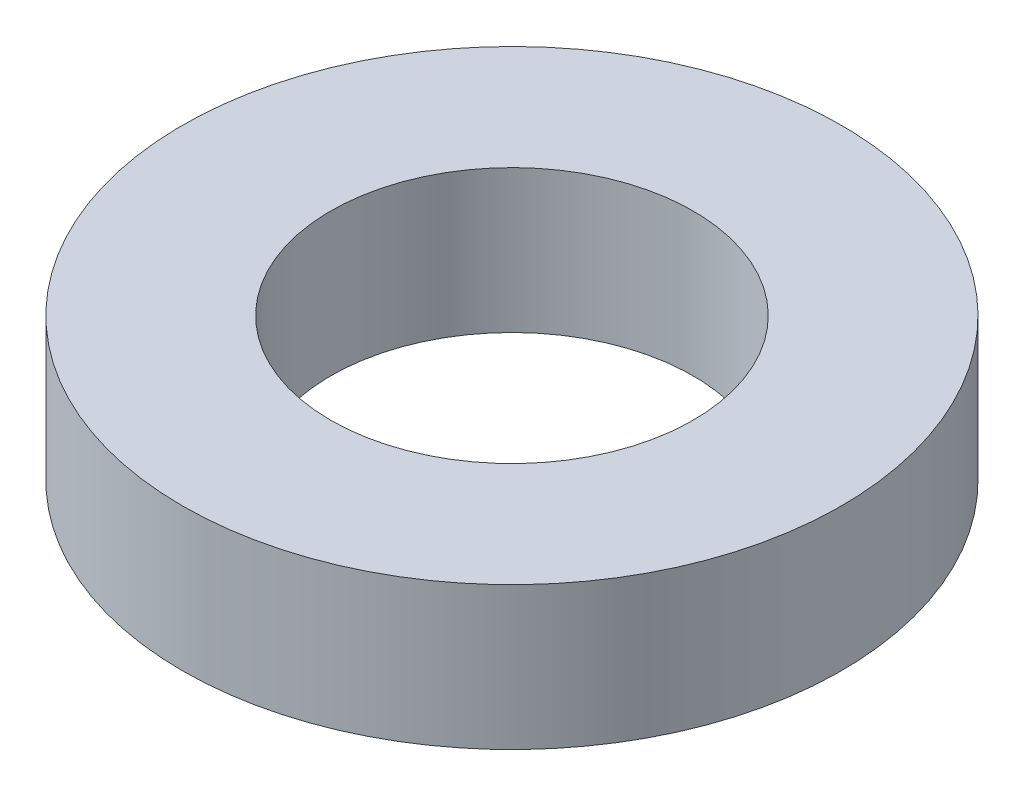
ISO-10303-21;
HEADER;
FILE_DESCRIPTION(('STEP AP214'),'2;1');
FILE_NAME('part.step','',(''),(''),'','','');
FILE_SCHEMA(('AUTOMOTIVE_DESIGN { 1 0 10303 214 1 1 1 1 }'));
ENDSEC;
DATA;
#1=APPLICATION_CONTEXT('core data for automotive mechanical design processes');
#2=APPLICATION_PROTOCOL_DEFINITION('international standard','automotive_design',2000,#1);
#3=PRODUCT_CONTEXT('',#1,'mechanical');
#4=PRODUCT('Part','Part','',(#3));
#5=PRODUCT_RELATED_PRODUCT_CATEGORY('part','',(#4));
#6=PRODUCT_DEFINITION_FORMATION('','',#4);
#7=PRODUCT_DEFINITION_CONTEXT('part definition',#1,'design');
#8=PRODUCT_DEFINITION('design','',#6,#7);
#9=PRODUCT_DEFINITION_SHAPE('','',#8);
#10=(LENGTH_UNIT() NAMED_UNIT(*) SI_UNIT(.MILLI.,.METRE.));
#11=(NAMED_UNIT(*) PLANE_ANGLE_UNIT() SI_UNIT($,.RADIAN.));
#12=(NAMED_UNIT(*) SI_UNIT($,.STERADIAN.) SOLID_ANGLE_UNIT());
#13=UNCERTAINTY_MEASURE_WITH_UNIT(LENGTH_MEASURE(1.E-05),#10,'distance_accuracy_value','');
#14=(GEOMETRIC_REPRESENTATION_CONTEXT(3) GLOBAL_UNCERTAINTY_ASSIGNED_CONTEXT((#13)) GLOBAL_UNIT_ASSIGNED_CONTEXT((#10,
#11,#12)) REPRESENTATION_CONTEXT('',''));
#15=CARTESIAN_POINT('',(0.,0.,0.));
#16=DIRECTION('',(0.,0.,1.));
#17=DIRECTION('',(1.,0.,0.));
#18=AXIS2_PLACEMENT_3D('',#15,#16,#17);
#19=CARTESIAN_POINT('',(0.,1.3,0.));
#20=DIRECTION('',(0.,1.,0.));
#21=DIRECTION('',(0.,0.,1.));
#22=AXIS2_PLACEMENT_3D('',#19,#20,#21);
#23=PLANE('',#22);
#24=CARTESIAN_POINT('',(0.,1.3,0.));
#25=DIRECTION('',(0.,1.,0.));
#26=DIRECTION('',(0.,0.,1.));
#27=AXIS2_PLACEMENT_3D('',#24,#25,#26);
#28=CIRCLE('',#27,3.);
#29=CARTESIAN_POINT('',(0.,1.3,3.));
#30=VERTEX_POINT('',#29);
#31=EDGE_CURVE('E10',#30,#30,#28,.T.);
#32=ORIENTED_EDGE('',*,*,#31,.T.);
#33=EDGE_LOOP('',(#32));
#34=FACE_BOUND('',#33,.T.);
#35=CARTESIAN_POINT('',(0.,1.3,0.));
#36=DIRECTION('',(0.,1.,0.));
#37=DIRECTION('',(0.,0.,1.));
#38=AXIS2_PLACEMENT_3D('',#35,#36,#37);
#39=CIRCLE('',#38,1.65);
#40=CARTESIAN_POINT('',(0.,1.3,1.65));
#41=VERTEX_POINT('',#40);
#42=EDGE_CURVE('E50',#41,#41,#39,.T.);
#43=ORIENTED_EDGE('',*,*,#42,.F.);
#44=EDGE_LOOP('',(#43));
#45=FACE_BOUND('',#44,.T.);
#46=ADVANCED_FACE('F37',(#34,#45),#23,.T.);
#47=CARTESIAN_POINT('',(0.,0.,0.));
#48=DIRECTION('',(0.,1.,0.));
#49=DIRECTION('',(0.,0.,1.));
#50=AXIS2_PLACEMENT_3D('',#47,#48,#49);
#51=PLANE('',#50);
#52=CARTESIAN_POINT('',(0.,0.,0.));
#53=DIRECTION('',(0.,1.,0.));
#54=DIRECTION('',(0.,0.,1.));
#55=AXIS2_PLACEMENT_3D('',#52,#53,#54);
#56=CIRCLE('',#55,3.);
#57=CARTESIAN_POINT('',(0.,0.,3.));
#58=VERTEX_POINT('',#57);
#59=EDGE_CURVE('E41',#58,#58,#56,.T.);
#60=ORIENTED_EDGE('',*,*,#59,.F.);
#61=EDGE_LOOP('',(#60));
#62=FACE_BOUND('',#61,.T.);
#63=CARTESIAN_POINT('',(0.,0.,0.));
#64=DIRECTION('',(0.,1.,0.));
#65=DIRECTION('',(0.,0.,1.));
#66=AXIS2_PLACEMENT_3D('',#63,#64,#65);
#67=CIRCLE('',#66,1.65);
#68=CARTESIAN_POINT('',(0.,0.,1.65));
#69=VERTEX_POINT('',#68);
#70=EDGE_CURVE('E52',#69,#69,#67,.T.);
#71=ORIENTED_EDGE('',*,*,#70,.T.);
#72=EDGE_LOOP('',(#71));
#73=FACE_BOUND('',#72,.T.);
#74=ADVANCED_FACE('F64',(#62,#73),#51,.F.);
#75=CARTESIAN_POINT('',(0.,1.3,0.));
#76=DIRECTION('',(0.,-1.,0.));
#77=DIRECTION('',(0.,0.,-1.));
#78=AXIS2_PLACEMENT_3D('',#75,#76,#77);
#79=CYLINDRICAL_SURFACE('',#78,3.);
#80=ORIENTED_EDGE('',*,*,#31,.F.);
#81=EDGE_LOOP('',(#80));
#82=FACE_BOUND('',#81,.T.);
#83=ORIENTED_EDGE('',*,*,#59,.T.);
#84=EDGE_LOOP('',(#83));
#85=FACE_BOUND('',#84,.T.);
#86=ADVANCED_FACE('F39',(#82,#85),#79,.T.);
#87=CARTESIAN_POINT('',(0.,1.3,0.));
#88=DIRECTION('',(0.,-1.,0.));
#89=DIRECTION('',(0.,0.,-1.));
#90=AXIS2_PLACEMENT_3D('',#87,#88,#89);
#91=CYLINDRICAL_SURFACE('',#90,1.65);
#92=ORIENTED_EDGE('',*,*,#42,.T.);
#93=EDGE_LOOP('',(#92));
#94=FACE_BOUND('',#93,.T.);
#95=ORIENTED_EDGE('',*,*,#70,.F.);
#96=EDGE_LOOP('',(#95));
#97=FACE_BOUND('',#96,.T.);
#98=ADVANCED_FACE('F60',(#94,#97),#91,.F.);
#99=CLOSED_SHELL('',(#46,#74,#86,#98));
#100=MANIFOLD_SOLID_BREP('B2',#99);
#101=ADVANCED_BREP_SHAPE_REPRESENTATION('',(#18,#100),#14);
#102=SHAPE_DEFINITION_REPRESENTATION(#9,#101);
ENDSEC;
END-ISO-10303-21;
